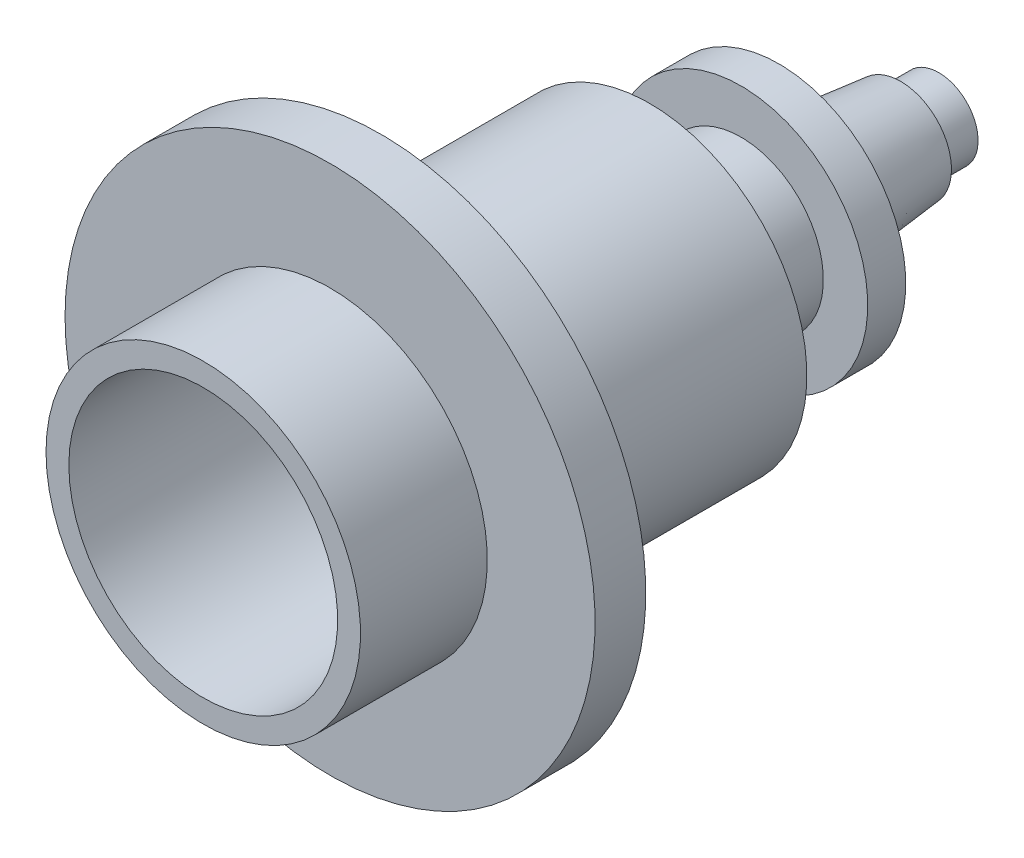
ISO-10303-21;
HEADER;
FILE_DESCRIPTION(('STEP AP214'),'2;1');
FILE_NAME('part.step','',(''),(''),'','','');
FILE_SCHEMA(('AUTOMOTIVE_DESIGN { 1 0 10303 214 1 1 1 1 }'));
ENDSEC;
DATA;
#1=APPLICATION_CONTEXT('core data for automotive mechanical design processes');
#2=APPLICATION_PROTOCOL_DEFINITION('international standard','automotive_design',2000,#1);
#3=PRODUCT_CONTEXT('',#1,'mechanical');
#4=PRODUCT('Part','Part','',(#3));
#5=PRODUCT_RELATED_PRODUCT_CATEGORY('part','',(#4));
#6=PRODUCT_DEFINITION_FORMATION('','',#4);
#7=PRODUCT_DEFINITION_CONTEXT('part definition',#1,'design');
#8=PRODUCT_DEFINITION('design','',#6,#7);
#9=PRODUCT_DEFINITION_SHAPE('','',#8);
#10=(LENGTH_UNIT() NAMED_UNIT(*) SI_UNIT(.MILLI.,.METRE.));
#11=(NAMED_UNIT(*) PLANE_ANGLE_UNIT() SI_UNIT($,.RADIAN.));
#12=(NAMED_UNIT(*) SI_UNIT($,.STERADIAN.) SOLID_ANGLE_UNIT());
#13=UNCERTAINTY_MEASURE_WITH_UNIT(LENGTH_MEASURE(1.E-05),#10,'distance_accuracy_value','');
#14=(GEOMETRIC_REPRESENTATION_CONTEXT(3) GLOBAL_UNCERTAINTY_ASSIGNED_CONTEXT((#13)) GLOBAL_UNIT_ASSIGNED_CONTEXT((#10,
#11,#12)) REPRESENTATION_CONTEXT('',''));
#15=CARTESIAN_POINT('',(0.,0.,0.));
#16=DIRECTION('',(0.,0.,1.));
#17=DIRECTION('',(1.,0.,0.));
#18=AXIS2_PLACEMENT_3D('',#15,#16,#17);
#19=CARTESIAN_POINT('',(0.,0.,0.));
#20=DIRECTION('',(0.,0.,-1.));
#21=DIRECTION('',(-1.,0.,0.));
#22=AXIS2_PLACEMENT_3D('',#19,#20,#21);
#23=CYLINDRICAL_SURFACE('',#22,0.25);
#24=CARTESIAN_POINT('',(0.,0.,5.70420771435142));
#25=DIRECTION('',(0.,0.,-1.));
#26=DIRECTION('',(-1.,0.,0.));
#27=AXIS2_PLACEMENT_3D('',#24,#25,#26);
#28=CIRCLE('',#27,0.25);
#29=CARTESIAN_POINT('',(0.249999999999999,0.,5.70420771435141));
#30=VERTEX_POINT('',#29);
#31=EDGE_CURVE('E10',#30,#30,#28,.T.);
#32=ORIENTED_EDGE('',*,*,#31,.F.);
#33=EDGE_LOOP('',(#32));
#34=FACE_BOUND('',#33,.T.);
#35=CARTESIAN_POINT('',(0.,0.,0.));
#36=DIRECTION('',(0.,0.,-1.));
#37=DIRECTION('',(-1.,0.,0.));
#38=AXIS2_PLACEMENT_3D('',#35,#36,#37);
#39=CIRCLE('',#38,0.25);
#40=CARTESIAN_POINT('',(-0.25,0.,0.));
#41=VERTEX_POINT('',#40);
#42=EDGE_CURVE('E112',#41,#41,#39,.T.);
#43=ORIENTED_EDGE('',*,*,#42,.T.);
#44=EDGE_LOOP('',(#43));
#45=FACE_BOUND('',#44,.T.);
#46=ADVANCED_FACE('F37',(#34,#45),#23,.F.);
#47=CARTESIAN_POINT('',(0.,0.,5.70420771435142));
#48=DIRECTION('',(0.,0.,1.));
#49=DIRECTION('',(1.,0.,0.));
#50=AXIS2_PLACEMENT_3D('',#47,#48,#49);
#51=CONICAL_SURFACE('',#50,0.25,1.30597899688911);
#52=CARTESIAN_POINT('',(0.,0.,6.35505517197854));
#53=DIRECTION('',(0.,0.,-1.));
#54=DIRECTION('',(-1.,0.,0.));
#55=AXIS2_PLACEMENT_3D('',#52,#53,#54);
#56=CIRCLE('',#55,2.65);
#57=CARTESIAN_POINT('',(2.65,0.,6.35505517197854));
#58=VERTEX_POINT('',#57);
#59=EDGE_CURVE('E44',#58,#58,#56,.T.);
#60=CARTESIAN_POINT('',(2.65,0.,6.35505517197854));
#61=CARTESIAN_POINT('',(2.625,0.,6.34827551096159));
#62=CARTESIAN_POINT('',(2.6,0.,6.34149584994464));
#63=CARTESIAN_POINT('',(2.55,0.,6.32793652791074));
#64=CARTESIAN_POINT('',(2.525,0.,6.32115686689379));
#65=CARTESIAN_POINT('',(2.475,0.,6.30759754485989));
#66=CARTESIAN_POINT('',(2.45,0.,6.30081788384294));
#67=CARTESIAN_POINT('',(2.4,0.,6.28725856180904));
#68=CARTESIAN_POINT('',(2.375,0.,6.28047890079209));
#69=CARTESIAN_POINT('',(2.325,0.,6.26691957875819));
#70=CARTESIAN_POINT('',(2.3,0.,6.26013991774125));
#71=CARTESIAN_POINT('',(2.25,0.,6.24658059570735));
#72=CARTESIAN_POINT('',(2.225,0.,6.2398009346904));
#73=CARTESIAN_POINT('',(2.175,0.,6.2262416126565));
#74=CARTESIAN_POINT('',(2.15,0.,6.21946195163955));
#75=CARTESIAN_POINT('',(2.1,0.,6.20590262960565));
#76=CARTESIAN_POINT('',(2.075,0.,6.19912296858871));
#77=CARTESIAN_POINT('',(2.025,0.,6.18556364655481));
#78=CARTESIAN_POINT('',(2.,0.,6.17878398553786));
#79=CARTESIAN_POINT('',(1.95,0.,6.16522466350396));
#80=CARTESIAN_POINT('',(1.925,0.,6.15844500248701));
#81=CARTESIAN_POINT('',(1.875,0.,6.14488568045311));
#82=CARTESIAN_POINT('',(1.85,0.,6.13810601943616));
#83=CARTESIAN_POINT('',(1.8,0.,6.12454669740226));
#84=CARTESIAN_POINT('',(1.775,0.,6.11776703638531));
#85=CARTESIAN_POINT('',(1.725,0.,6.10420771435142));
#86=CARTESIAN_POINT('',(1.7,0.,6.09742805333447));
#87=CARTESIAN_POINT('',(1.65,0.,6.08386873130057));
#88=CARTESIAN_POINT('',(1.625,0.,6.07708907028362));
#89=CARTESIAN_POINT('',(1.575,0.,6.06352974824972));
#90=CARTESIAN_POINT('',(1.55,0.,6.05675008723277));
#91=CARTESIAN_POINT('',(1.5,0.,6.04319076519887));
#92=CARTESIAN_POINT('',(1.475,0.,6.03641110418193));
#93=CARTESIAN_POINT('',(1.425,0.,6.02285178214803));
#94=CARTESIAN_POINT('',(1.4,0.,6.01607212113108));
#95=CARTESIAN_POINT('',(1.35,0.,6.00251279909718));
#96=CARTESIAN_POINT('',(1.325,0.,5.99573313808023));
#97=CARTESIAN_POINT('',(1.275,0.,5.98217381604633));
#98=CARTESIAN_POINT('',(1.25,0.,5.97539415502938));
#99=CARTESIAN_POINT('',(1.2,0.,5.96183483299548));
#100=CARTESIAN_POINT('',(1.175,0.,5.95505517197853));
#101=CARTESIAN_POINT('',(1.125,0.,5.94149584994464));
#102=CARTESIAN_POINT('',(1.1,0.,5.93471618892769));
#103=CARTESIAN_POINT('',(1.05,0.,5.92115686689379));
#104=CARTESIAN_POINT('',(1.025,0.,5.91437720587684));
#105=CARTESIAN_POINT('',(0.974999999999999,0.,5.90081788384294));
#106=CARTESIAN_POINT('',(0.949999999999999,0.,5.89403822282599));
#107=CARTESIAN_POINT('',(0.899999999999999,0.,5.88047890079209));
#108=CARTESIAN_POINT('',(0.874999999999999,0.,5.87369923977515));
#109=CARTESIAN_POINT('',(0.824999999999999,0.,5.86013991774125));
#110=CARTESIAN_POINT('',(0.799999999999999,0.,5.8533602567243));
#111=CARTESIAN_POINT('',(0.749999999999999,0.,5.8398009346904));
#112=CARTESIAN_POINT('',(0.724999999999999,0.,5.83302127367345));
#113=CARTESIAN_POINT('',(0.674999999999999,0.,5.81946195163955));
#114=CARTESIAN_POINT('',(0.649999999999999,0.,5.8126822906226));
#115=CARTESIAN_POINT('',(0.599999999999999,0.,5.7991229685887));
#116=CARTESIAN_POINT('',(0.574999999999999,0.,5.79234330757175));
#117=CARTESIAN_POINT('',(0.524999999999999,0.,5.77878398553786));
#118=CARTESIAN_POINT('',(0.499999999999999,0.,5.77200432452091));
#119=CARTESIAN_POINT('',(0.449999999999999,0.,5.75844500248701));
#120=CARTESIAN_POINT('',(0.424999999999999,0.,5.75166534147006));
#121=CARTESIAN_POINT('',(0.374999999999999,0.,5.73810601943616));
#122=CARTESIAN_POINT('',(0.349999999999999,0.,5.73132635841921));
#123=CARTESIAN_POINT('',(0.299999999999999,0.,5.71776703638531));
#124=CARTESIAN_POINT('',(0.274999999999999,0.,5.71098737536837));
#125=CARTESIAN_POINT('',(0.249999999999999,0.,5.70420771435142));
#126=B_SPLINE_CURVE_WITH_KNOTS('',3,(#60,#61,#62,#63,#64,#65,#66,#67,#68,#69,#70,#71,#72,#73,
#74,#75,#76,#77,#78,#79,#80,#81,#82,#83,#84,#85,#86,#87,#88,#89,#90,#91,#92,#93,#94,#95,#96,#97,
#98,#99,#100,#101,#102,#103,#104,#105,#106,#107,#108,#109,#110,#111,#112,#113,#114,#115,#116,
#117,#118,#119,#120,#121,#122,#123,#124,#125),.UNSPECIFIED.,.F.,.F.,(4,2,2,2,2,2,2,2,2,2,2,2,2,
2,2,2,2,2,2,2,2,2,2,2,2,2,2,2,2,2,2,2,4),(0.,0.0777089070283629,0.155417814056725,
0.233126721085087,0.310835628113449,0.388544535141812,0.466253442170174,0.543962349198537,
0.621671256226899,0.699380163255261,0.777089070283624,0.854797977311986,0.932506884340349,
1.01021579136871,1.08792469839707,1.16563360542544,1.2433425124538,1.32105141948216,
1.39876032651052,1.47646923353888,1.55417814056725,1.63188704759561,1.70959595462397,
1.78730486165233,1.8650137686807,1.94272267570906,2.02043158273742,2.09814048976578,
2.17584939679415,2.25355830382251,2.33126721085087,2.40897611787923,2.4866850249076),.UNSPECIFIED.);
#127=EDGE_CURVE('BSEAM210',#58,#30,#126,.T.);
#128=ORIENTED_EDGE('',*,*,#59,.F.);
#129=ORIENTED_EDGE('',*,*,#31,.T.);
#130=ORIENTED_EDGE('',*,*,#127,.T.);
#131=ORIENTED_EDGE('',*,*,#127,.F.);
#132=EDGE_LOOP('',(#128,#130,#129,#131));
#133=FACE_BOUND('',#132,.T.);
#134=ADVANCED_FACE('F210',(#133),#51,.F.);
#135=CARTESIAN_POINT('',(0.,0.,0.));
#136=DIRECTION('',(0.,0.,-1.));
#137=DIRECTION('',(-1.,0.,0.));
#138=AXIS2_PLACEMENT_3D('',#135,#136,#137);
#139=CYLINDRICAL_SURFACE('',#138,2.65);
#140=CARTESIAN_POINT('',(0.,0.,14.5));
#141=DIRECTION('',(0.,0.,-1.));
#142=DIRECTION('',(-1.,0.,0.));
#143=AXIS2_PLACEMENT_3D('',#140,#141,#142);
#144=CIRCLE('',#143,2.65);
#145=CARTESIAN_POINT('',(-2.65,0.,14.5));
#146=VERTEX_POINT('',#145);
#147=EDGE_CURVE('E49',#146,#146,#144,.T.);
#148=ORIENTED_EDGE('',*,*,#147,.F.);
#149=EDGE_LOOP('',(#148));
#150=FACE_BOUND('',#149,.T.);
#151=ORIENTED_EDGE('',*,*,#59,.T.);
#152=EDGE_LOOP('',(#151));
#153=FACE_BOUND('',#152,.T.);
#154=ADVANCED_FACE('F205',(#150,#153),#139,.F.);
#155=CARTESIAN_POINT('',(2.65,0.,14.5));
#156=DIRECTION('',(0.,0.,-1.));
#157=DIRECTION('',(-1.,0.,0.));
#158=AXIS2_PLACEMENT_3D('',#155,#156,#157);
#159=PLANE('',#158);
#160=CARTESIAN_POINT('',(0.,0.,14.5));
#161=DIRECTION('',(0.,0.,-1.));
#162=DIRECTION('',(-1.,0.,0.));
#163=AXIS2_PLACEMENT_3D('',#160,#161,#162);
#164=CIRCLE('',#163,3.1);
#165=CARTESIAN_POINT('',(-3.1,0.,14.5));
#166=VERTEX_POINT('',#165);
#167=EDGE_CURVE('E54',#166,#166,#164,.T.);
#168=ORIENTED_EDGE('',*,*,#167,.F.);
#169=EDGE_LOOP('',(#168));
#170=FACE_BOUND('',#169,.T.);
#171=ORIENTED_EDGE('',*,*,#147,.T.);
#172=EDGE_LOOP('',(#171));
#173=FACE_BOUND('',#172,.T.);
#174=ADVANCED_FACE('F199',(#170,#173),#159,.F.);
#175=CARTESIAN_POINT('',(0.,0.,0.));
#176=DIRECTION('',(0.,0.,-1.));
#177=DIRECTION('',(-1.,0.,0.));
#178=AXIS2_PLACEMENT_3D('',#175,#176,#177);
#179=CYLINDRICAL_SURFACE('',#178,3.1);
#180=CARTESIAN_POINT('',(0.,0.,12.));
#181=DIRECTION('',(0.,0.,-1.));
#182=DIRECTION('',(-1.,0.,0.));
#183=AXIS2_PLACEMENT_3D('',#180,#181,#182);
#184=CIRCLE('',#183,3.1);
#185=CARTESIAN_POINT('',(-3.1,0.,12.));
#186=VERTEX_POINT('',#185);
#187=EDGE_CURVE('E60',#186,#186,#184,.T.);
#188=ORIENTED_EDGE('',*,*,#187,.F.);
#189=EDGE_LOOP('',(#188));
#190=FACE_BOUND('',#189,.T.);
#191=ORIENTED_EDGE('',*,*,#167,.T.);
#192=EDGE_LOOP('',(#191));
#193=FACE_BOUND('',#192,.T.);
#194=ADVANCED_FACE('F193',(#190,#193),#179,.T.);
#195=CARTESIAN_POINT('',(3.1,0.,12.));
#196=DIRECTION('',(0.,0.,-1.));
#197=DIRECTION('',(-1.,0.,0.));
#198=AXIS2_PLACEMENT_3D('',#195,#196,#197);
#199=PLANE('',#198);
#200=CARTESIAN_POINT('',(0.,0.,12.));
#201=DIRECTION('',(0.,0.,-1.));
#202=DIRECTION('',(-1.,0.,0.));
#203=AXIS2_PLACEMENT_3D('',#200,#201,#202);
#204=CIRCLE('',#203,5.225);
#205=CARTESIAN_POINT('',(-5.225,0.,12.));
#206=VERTEX_POINT('',#205);
#207=EDGE_CURVE('E64',#206,#206,#204,.T.);
#208=ORIENTED_EDGE('',*,*,#207,.F.);
#209=EDGE_LOOP('',(#208));
#210=FACE_BOUND('',#209,.T.);
#211=ORIENTED_EDGE('',*,*,#187,.T.);
#212=EDGE_LOOP('',(#211));
#213=FACE_BOUND('',#212,.T.);
#214=ADVANCED_FACE('F187',(#210,#213),#199,.F.);
#215=CARTESIAN_POINT('',(0.,0.,0.));
#216=DIRECTION('',(0.,0.,-1.));
#217=DIRECTION('',(-1.,0.,0.));
#218=AXIS2_PLACEMENT_3D('',#215,#216,#217);
#219=CYLINDRICAL_SURFACE('',#218,5.225);
#220=CARTESIAN_POINT('',(0.,0.,11.));
#221=DIRECTION('',(0.,0.,-1.));
#222=DIRECTION('',(-1.,0.,0.));
#223=AXIS2_PLACEMENT_3D('',#220,#221,#222);
#224=CIRCLE('',#223,5.225);
#225=CARTESIAN_POINT('',(-5.225,0.,11.));
#226=VERTEX_POINT('',#225);
#227=EDGE_CURVE('E68',#226,#226,#224,.T.);
#228=ORIENTED_EDGE('',*,*,#227,.F.);
#229=EDGE_LOOP('',(#228));
#230=FACE_BOUND('',#229,.T.);
#231=ORIENTED_EDGE('',*,*,#207,.T.);
#232=EDGE_LOOP('',(#231));
#233=FACE_BOUND('',#232,.T.);
#234=ADVANCED_FACE('F181',(#230,#233),#219,.T.);
#235=CARTESIAN_POINT('',(5.225,0.,11.));
#236=DIRECTION('',(0.,0.,1.));
#237=DIRECTION('',(1.,0.,0.));
#238=AXIS2_PLACEMENT_3D('',#235,#236,#237);
#239=PLANE('',#238);
#240=CARTESIAN_POINT('',(0.,0.,11.));
#241=DIRECTION('',(0.,0.,-1.));
#242=DIRECTION('',(-1.,0.,0.));
#243=AXIS2_PLACEMENT_3D('',#240,#241,#242);
#244=CIRCLE('',#243,3.1);
#245=CARTESIAN_POINT('',(-3.1,0.,11.));
#246=VERTEX_POINT('',#245);
#247=EDGE_CURVE('E72',#246,#246,#244,.T.);
#248=ORIENTED_EDGE('',*,*,#247,.F.);
#249=EDGE_LOOP('',(#248));
#250=FACE_BOUND('',#249,.T.);
#251=ORIENTED_EDGE('',*,*,#227,.T.);
#252=EDGE_LOOP('',(#251));
#253=FACE_BOUND('',#252,.T.);
#254=ADVANCED_FACE('F175',(#250,#253),#239,.F.);
#255=CARTESIAN_POINT('',(0.,0.,0.));
#256=DIRECTION('',(0.,0.,-1.));
#257=DIRECTION('',(-1.,0.,0.));
#258=AXIS2_PLACEMENT_3D('',#255,#256,#257);
#259=CYLINDRICAL_SURFACE('',#258,3.1);
#260=CARTESIAN_POINT('',(0.,0.,5.7));
#261=DIRECTION('',(0.,0.,-1.));
#262=DIRECTION('',(-1.,0.,0.));
#263=AXIS2_PLACEMENT_3D('',#260,#261,#262);
#264=CIRCLE('',#263,3.1);
#265=CARTESIAN_POINT('',(-3.09999999999999,0.,5.7));
#266=VERTEX_POINT('',#265);
#267=EDGE_CURVE('E76',#266,#266,#264,.T.);
#268=ORIENTED_EDGE('',*,*,#267,.F.);
#269=EDGE_LOOP('',(#268));
#270=FACE_BOUND('',#269,.T.);
#271=ORIENTED_EDGE('',*,*,#247,.T.);
#272=EDGE_LOOP('',(#271));
#273=FACE_BOUND('',#272,.T.);
#274=ADVANCED_FACE('F169',(#270,#273),#259,.T.);
#275=CARTESIAN_POINT('',(0.,0.,5.7));
#276=DIRECTION('',(0.,0.,1.));
#277=DIRECTION('',(1.,0.,0.));
#278=AXIS2_PLACEMENT_3D('',#275,#276,#277);
#279=CONICAL_SURFACE('',#278,3.1,1.30597899688911);
#280=CARTESIAN_POINT('',(0.,0.,5.3));
#281=DIRECTION('',(0.,0.,-1.));
#282=DIRECTION('',(-1.,0.,0.));
#283=AXIS2_PLACEMENT_3D('',#280,#281,#282);
#284=CIRCLE('',#283,1.625);
#285=CARTESIAN_POINT('',(-1.625,0.,5.3));
#286=VERTEX_POINT('',#285);
#287=EDGE_CURVE('E80',#286,#286,#284,.T.);
#288=ORIENTED_EDGE('',*,*,#287,.F.);
#289=EDGE_LOOP('',(#288));
#290=FACE_BOUND('',#289,.T.);
#291=ORIENTED_EDGE('',*,*,#267,.T.);
#292=EDGE_LOOP('',(#291));
#293=FACE_BOUND('',#292,.T.);
#294=ADVANCED_FACE('F163',(#290,#293),#279,.T.);
#295=CARTESIAN_POINT('',(0.,0.,0.));
#296=DIRECTION('',(0.,0.,-1.));
#297=DIRECTION('',(-1.,0.,0.));
#298=AXIS2_PLACEMENT_3D('',#295,#296,#297);
#299=CYLINDRICAL_SURFACE('',#298,1.625);
#300=CARTESIAN_POINT('',(0.,0.,3.9));
#301=DIRECTION('',(0.,0.,-1.));
#302=DIRECTION('',(-1.,0.,0.));
#303=AXIS2_PLACEMENT_3D('',#300,#301,#302);
#304=CIRCLE('',#303,1.625);
#305=CARTESIAN_POINT('',(-1.625,0.,3.9));
#306=VERTEX_POINT('',#305);
#307=EDGE_CURVE('E84',#306,#306,#304,.T.);
#308=ORIENTED_EDGE('',*,*,#307,.F.);
#309=EDGE_LOOP('',(#308));
#310=FACE_BOUND('',#309,.T.);
#311=ORIENTED_EDGE('',*,*,#287,.T.);
#312=EDGE_LOOP('',(#311));
#313=FACE_BOUND('',#312,.T.);
#314=ADVANCED_FACE('F157',(#310,#313),#299,.T.);
#315=CARTESIAN_POINT('',(1.625,0.,3.9));
#316=DIRECTION('',(0.,0.,-1.));
#317=DIRECTION('',(-1.,0.,0.));
#318=AXIS2_PLACEMENT_3D('',#315,#316,#317);
#319=PLANE('',#318);
#320=CARTESIAN_POINT('',(0.,0.,3.9));
#321=DIRECTION('',(0.,0.,-1.));
#322=DIRECTION('',(-1.,0.,0.));
#323=AXIS2_PLACEMENT_3D('',#320,#321,#322);
#324=CIRCLE('',#323,2.5);
#325=CARTESIAN_POINT('',(-2.5,0.,3.9));
#326=VERTEX_POINT('',#325);
#327=EDGE_CURVE('E88',#326,#326,#324,.T.);
#328=ORIENTED_EDGE('',*,*,#327,.F.);
#329=EDGE_LOOP('',(#328));
#330=FACE_BOUND('',#329,.T.);
#331=ORIENTED_EDGE('',*,*,#307,.T.);
#332=EDGE_LOOP('',(#331));
#333=FACE_BOUND('',#332,.T.);
#334=ADVANCED_FACE('F151',(#330,#333),#319,.F.);
#335=CARTESIAN_POINT('',(0.,0.,0.));
#336=DIRECTION('',(0.,0.,-1.));
#337=DIRECTION('',(-1.,0.,0.));
#338=AXIS2_PLACEMENT_3D('',#335,#336,#337);
#339=CYLINDRICAL_SURFACE('',#338,2.5);
#340=CARTESIAN_POINT('',(0.,0.,3.15));
#341=DIRECTION('',(0.,0.,-1.));
#342=DIRECTION('',(-1.,0.,0.));
#343=AXIS2_PLACEMENT_3D('',#340,#341,#342);
#344=CIRCLE('',#343,2.5);
#345=CARTESIAN_POINT('',(-2.5,0.,3.15));
#346=VERTEX_POINT('',#345);
#347=EDGE_CURVE('E92',#346,#346,#344,.T.);
#348=ORIENTED_EDGE('',*,*,#347,.F.);
#349=EDGE_LOOP('',(#348));
#350=FACE_BOUND('',#349,.T.);
#351=ORIENTED_EDGE('',*,*,#327,.T.);
#352=EDGE_LOOP('',(#351));
#353=FACE_BOUND('',#352,.T.);
#354=ADVANCED_FACE('F145',(#350,#353),#339,.T.);
#355=CARTESIAN_POINT('',(2.5,0.,3.15));
#356=DIRECTION('',(0.,0.,1.));
#357=DIRECTION('',(1.,0.,0.));
#358=AXIS2_PLACEMENT_3D('',#355,#356,#357);
#359=PLANE('',#358);
#360=CARTESIAN_POINT('',(0.,0.,3.15));
#361=DIRECTION('',(0.,0.,-1.));
#362=DIRECTION('',(-1.,0.,0.));
#363=AXIS2_PLACEMENT_3D('',#360,#361,#362);
#364=CIRCLE('',#363,1.25);
#365=CARTESIAN_POINT('',(-1.25,0.,3.15));
#366=VERTEX_POINT('',#365);
#367=EDGE_CURVE('E96',#366,#366,#364,.T.);
#368=ORIENTED_EDGE('',*,*,#367,.F.);
#369=EDGE_LOOP('',(#368));
#370=FACE_BOUND('',#369,.T.);
#371=ORIENTED_EDGE('',*,*,#347,.T.);
#372=EDGE_LOOP('',(#371));
#373=FACE_BOUND('',#372,.T.);
#374=ADVANCED_FACE('F139',(#370,#373),#359,.F.);
#375=CARTESIAN_POINT('',(0.,0.,3.15));
#376=DIRECTION('',(0.,0.,1.));
#377=DIRECTION('',(1.,0.,0.));
#378=AXIS2_PLACEMENT_3D('',#375,#376,#377);
#379=CONICAL_SURFACE('',#378,1.25,0.103792340457043);
#380=CARTESIAN_POINT('',(0.,0.,0.75));
#381=DIRECTION('',(0.,0.,-1.));
#382=DIRECTION('',(-1.,0.,0.));
#383=AXIS2_PLACEMENT_3D('',#380,#381,#382);
#384=CIRCLE('',#383,1.);
#385=CARTESIAN_POINT('',(-1.,0.,0.75));
#386=VERTEX_POINT('',#385);
#387=EDGE_CURVE('E100',#386,#386,#384,.T.);
#388=ORIENTED_EDGE('',*,*,#387,.F.);
#389=EDGE_LOOP('',(#388));
#390=FACE_BOUND('',#389,.T.);
#391=ORIENTED_EDGE('',*,*,#367,.T.);
#392=EDGE_LOOP('',(#391));
#393=FACE_BOUND('',#392,.T.);
#394=ADVANCED_FACE('F133',(#390,#393),#379,.T.);
#395=CARTESIAN_POINT('',(1.,0.,0.75));
#396=DIRECTION('',(0.,0.,1.));
#397=DIRECTION('',(1.,0.,0.));
#398=AXIS2_PLACEMENT_3D('',#395,#396,#397);
#399=PLANE('',#398);
#400=CARTESIAN_POINT('',(0.,0.,0.75));
#401=DIRECTION('',(0.,0.,-1.));
#402=DIRECTION('',(-1.,0.,0.));
#403=AXIS2_PLACEMENT_3D('',#400,#401,#402);
#404=CIRCLE('',#403,0.775);
#405=CARTESIAN_POINT('',(-0.775,0.,0.75));
#406=VERTEX_POINT('',#405);
#407=EDGE_CURVE('E104',#406,#406,#404,.T.);
#408=ORIENTED_EDGE('',*,*,#407,.F.);
#409=EDGE_LOOP('',(#408));
#410=FACE_BOUND('',#409,.T.);
#411=ORIENTED_EDGE('',*,*,#387,.T.);
#412=EDGE_LOOP('',(#411));
#413=FACE_BOUND('',#412,.T.);
#414=ADVANCED_FACE('F127',(#410,#413),#399,.F.);
#415=CARTESIAN_POINT('',(0.,0.,0.));
#416=DIRECTION('',(0.,0.,-1.));
#417=DIRECTION('',(-1.,0.,0.));
#418=AXIS2_PLACEMENT_3D('',#415,#416,#417);
#419=CYLINDRICAL_SURFACE('',#418,0.775);
#420=CARTESIAN_POINT('',(0.,0.,0.));
#421=DIRECTION('',(0.,0.,-1.));
#422=DIRECTION('',(-1.,0.,0.));
#423=AXIS2_PLACEMENT_3D('',#420,#421,#422);
#424=CIRCLE('',#423,0.775);
#425=CARTESIAN_POINT('',(-0.775,0.,0.));
#426=VERTEX_POINT('',#425);
#427=EDGE_CURVE('E108',#426,#426,#424,.T.);
#428=ORIENTED_EDGE('',*,*,#427,.F.);
#429=EDGE_LOOP('',(#428));
#430=FACE_BOUND('',#429,.T.);
#431=ORIENTED_EDGE('',*,*,#407,.T.);
#432=EDGE_LOOP('',(#431));
#433=FACE_BOUND('',#432,.T.);
#434=ADVANCED_FACE('F121',(#430,#433),#419,.T.);
#435=CARTESIAN_POINT('',(0.775,0.,0.));
#436=DIRECTION('',(0.,0.,1.));
#437=DIRECTION('',(1.,0.,0.));
#438=AXIS2_PLACEMENT_3D('',#435,#436,#437);
#439=PLANE('',#438);
#440=ORIENTED_EDGE('',*,*,#42,.F.);
#441=EDGE_LOOP('',(#440));
#442=FACE_BOUND('',#441,.T.);
#443=ORIENTED_EDGE('',*,*,#427,.T.);
#444=EDGE_LOOP('',(#443));
#445=FACE_BOUND('',#444,.T.);
#446=ADVANCED_FACE('F118',(#442,#445),#439,.F.);
#447=CLOSED_SHELL('',(#46,#134,#154,#174,#194,#214,#234,#254,#274,#294,#314,#334,#354,#374,#394,
#414,#434,#446));
#448=MANIFOLD_SOLID_BREP('B2',#447);
#449=ADVANCED_BREP_SHAPE_REPRESENTATION('',(#18,#448),#14);
#450=SHAPE_DEFINITION_REPRESENTATION(#9,#449);
ENDSEC;
END-ISO-10303-21;
